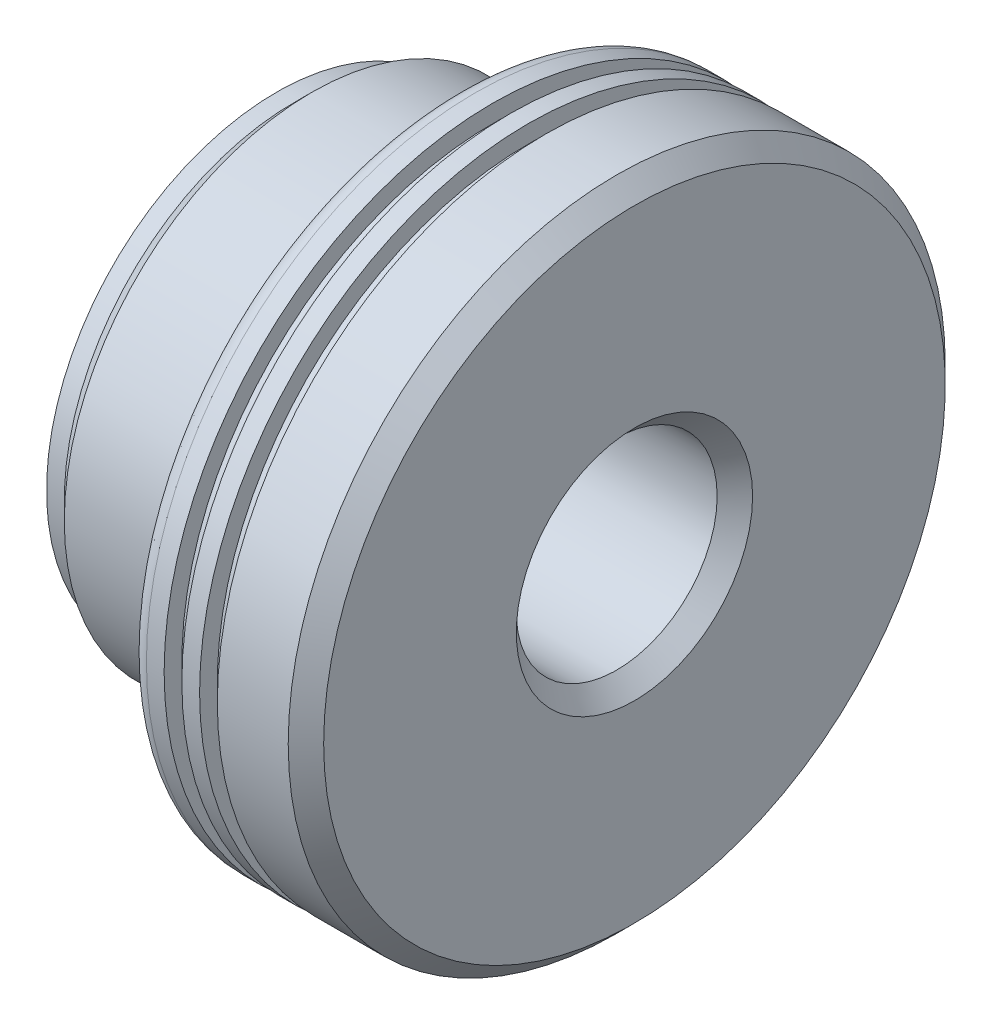
ISO-10303-21;
HEADER;
FILE_DESCRIPTION(('STEP AP214'),'2;1');
FILE_NAME('part.step','',(''),(''),'','','');
FILE_SCHEMA(('AUTOMOTIVE_DESIGN { 1 0 10303 214 1 1 1 1 }'));
ENDSEC;
DATA;
#1=APPLICATION_CONTEXT('core data for automotive mechanical design processes');
#2=APPLICATION_PROTOCOL_DEFINITION('international standard','automotive_design',2000,#1);
#3=PRODUCT_CONTEXT('',#1,'mechanical');
#4=PRODUCT('Part','Part','',(#3));
#5=PRODUCT_RELATED_PRODUCT_CATEGORY('part','',(#4));
#6=PRODUCT_DEFINITION_FORMATION('','',#4);
#7=PRODUCT_DEFINITION_CONTEXT('part definition',#1,'design');
#8=PRODUCT_DEFINITION('design','',#6,#7);
#9=PRODUCT_DEFINITION_SHAPE('','',#8);
#10=(LENGTH_UNIT() NAMED_UNIT(*) SI_UNIT(.MILLI.,.METRE.));
#11=(NAMED_UNIT(*) PLANE_ANGLE_UNIT() SI_UNIT($,.RADIAN.));
#12=(NAMED_UNIT(*) SI_UNIT($,.STERADIAN.) SOLID_ANGLE_UNIT());
#13=UNCERTAINTY_MEASURE_WITH_UNIT(LENGTH_MEASURE(1.E-05),#10,'distance_accuracy_value','');
#14=(GEOMETRIC_REPRESENTATION_CONTEXT(3) GLOBAL_UNCERTAINTY_ASSIGNED_CONTEXT((#13)) GLOBAL_UNIT_ASSIGNED_CONTEXT((#10,
#11,#12)) REPRESENTATION_CONTEXT('',''));
#15=CARTESIAN_POINT('',(0.,0.,0.));
#16=DIRECTION('',(0.,0.,1.));
#17=DIRECTION('',(1.,0.,0.));
#18=AXIS2_PLACEMENT_3D('',#15,#16,#17);
#19=CARTESIAN_POINT('',(-1.5,0.,2.2875));
#20=DIRECTION('',(-1.,0.,0.));
#21=DIRECTION('',(0.,0.,1.));
#22=AXIS2_PLACEMENT_3D('',#19,#20,#21);
#23=PLANE('',#22);
#24=CARTESIAN_POINT('',(-1.50000000000002,0.,0.));
#25=DIRECTION('',(1.,0.,0.));
#26=DIRECTION('',(0.,0.,1.));
#27=AXIS2_PLACEMENT_3D('',#24,#25,#26);
#28=CIRCLE('',#27,2.63);
#29=CARTESIAN_POINT('',(-1.50000000000001,0.,2.63));
#30=VERTEX_POINT('',#29);
#31=CARTESIAN_POINT('',(-1.50000000000001,0.,-2.63));
#32=VERTEX_POINT('',#31);
#33=EDGE_CURVE('E56',#30,#32,#28,.T.);
#34=ORIENTED_EDGE('',*,*,#33,.F.);
#35=CARTESIAN_POINT('',(-1.50000000000002,0.,0.));
#36=DIRECTION('',(1.,0.,0.));
#37=DIRECTION('',(0.,0.,-1.));
#38=AXIS2_PLACEMENT_3D('',#35,#36,#37);
#39=CIRCLE('',#38,2.63);
#40=EDGE_CURVE('E51',#32,#30,#39,.T.);
#41=ORIENTED_EDGE('',*,*,#40,.F.);
#42=EDGE_LOOP('',(#34,#41));
#43=FACE_BOUND('',#42,.T.);
#44=CARTESIAN_POINT('',(-1.49999999999996,0.,0.));
#45=DIRECTION('',(-1.,0.,0.));
#46=DIRECTION('',(0.,0.,-1.));
#47=AXIS2_PLACEMENT_3D('',#44,#45,#46);
#48=CIRCLE('',#47,1.945);
#49=CARTESIAN_POINT('',(-1.49999999999998,0.,1.945));
#50=VERTEX_POINT('',#49);
#51=CARTESIAN_POINT('',(-1.49999999999998,0.,-1.945));
#52=VERTEX_POINT('',#51);
#53=EDGE_CURVE('E65',#50,#52,#48,.F.);
#54=ORIENTED_EDGE('',*,*,#53,.T.);
#55=CARTESIAN_POINT('',(-1.49999999999996,0.,0.));
#56=DIRECTION('',(-1.,0.,0.));
#57=DIRECTION('',(0.,0.,1.));
#58=AXIS2_PLACEMENT_3D('',#55,#56,#57);
#59=CIRCLE('',#58,1.945);
#60=EDGE_CURVE('E104',#52,#50,#59,.F.);
#61=ORIENTED_EDGE('',*,*,#60,.T.);
#62=EDGE_LOOP('',(#54,#61));
#63=FACE_BOUND('',#62,.T.);
#64=ADVANCED_FACE('F16',(#43,#63),#23,.T.);
#65=CARTESIAN_POINT('',(-1.35000000000002,0.,0.));
#66=DIRECTION('',(1.,0.,0.));
#67=DIRECTION('',(0.,0.,-1.));
#68=AXIS2_PLACEMENT_3D('',#65,#66,#67);
#69=TOROIDAL_SURFACE('',#68,2.63,0.15);
#70=ORIENTED_EDGE('',*,*,#40,.T.);
#71=ORIENTED_EDGE('',*,*,#33,.T.);
#72=EDGE_LOOP('',(#70,#71));
#73=FACE_BOUND('',#72,.T.);
#74=CARTESIAN_POINT('',(-1.35,0.,0.));
#75=DIRECTION('',(1.,0.,0.));
#76=DIRECTION('',(0.,0.,-1.));
#77=AXIS2_PLACEMENT_3D('',#74,#75,#76);
#78=CIRCLE('',#77,2.78);
#79=CARTESIAN_POINT('',(-1.35,0.,-2.78));
#80=VERTEX_POINT('',#79);
#81=EDGE_CURVE('E91',#80,#80,#78,.T.);
#82=ORIENTED_EDGE('',*,*,#81,.F.);
#83=EDGE_LOOP('',(#82));
#84=FACE_BOUND('',#83,.T.);
#85=ADVANCED_FACE('F62',(#73,#84),#69,.T.);
#86=CARTESIAN_POINT('',(-1.64999999999996,0.,0.));
#87=DIRECTION('',(1.,0.,0.));
#88=DIRECTION('',(0.,0.,-1.));
#89=AXIS2_PLACEMENT_3D('',#86,#87,#88);
#90=TOROIDAL_SURFACE('',#89,1.945,0.15);
#91=ORIENTED_EDGE('',*,*,#60,.F.);
#92=ORIENTED_EDGE('',*,*,#53,.F.);
#93=EDGE_LOOP('',(#91,#92));
#94=FACE_BOUND('',#93,.T.);
#95=CARTESIAN_POINT('',(-1.65,0.,0.));
#96=DIRECTION('',(1.,0.,0.));
#97=DIRECTION('',(0.,0.,-1.));
#98=AXIS2_PLACEMENT_3D('',#95,#96,#97);
#99=CIRCLE('',#98,1.795);
#100=CARTESIAN_POINT('',(-1.65,0.,-1.795));
#101=VERTEX_POINT('',#100);
#102=EDGE_CURVE('E175',#101,#101,#99,.F.);
#103=ORIENTED_EDGE('',*,*,#102,.F.);
#104=EDGE_LOOP('',(#103));
#105=FACE_BOUND('',#104,.T.);
#106=ADVANCED_FACE('F83',(#94,#105),#90,.F.);
#107=CARTESIAN_POINT('',(-1.275,0.,0.));
#108=DIRECTION('',(1.,0.,0.));
#109=DIRECTION('',(0.,0.,-1.));
#110=AXIS2_PLACEMENT_3D('',#107,#108,#109);
#111=CYLINDRICAL_SURFACE('',#110,2.78);
#112=ORIENTED_EDGE('',*,*,#81,.T.);
#113=EDGE_LOOP('',(#112));
#114=FACE_BOUND('',#113,.T.);
#115=CARTESIAN_POINT('',(-1.2,0.,0.));
#116=DIRECTION('',(1.,0.,0.));
#117=DIRECTION('',(0.,0.,-1.));
#118=AXIS2_PLACEMENT_3D('',#115,#116,#117);
#119=CIRCLE('',#118,2.78);
#120=CARTESIAN_POINT('',(-1.2,0.,-2.78));
#121=VERTEX_POINT('',#120);
#122=EDGE_CURVE('E174',#121,#121,#119,.T.);
#123=ORIENTED_EDGE('',*,*,#122,.F.);
#124=EDGE_LOOP('',(#123));
#125=FACE_BOUND('',#124,.T.);
#126=ADVANCED_FACE('F188',(#114,#125),#111,.T.);
#127=CARTESIAN_POINT('',(-1.6875,0.,0.));
#128=DIRECTION('',(1.,0.,0.));
#129=DIRECTION('',(0.,0.,-1.));
#130=AXIS2_PLACEMENT_3D('',#127,#128,#129);
#131=CYLINDRICAL_SURFACE('',#130,1.795);
#132=ORIENTED_EDGE('',*,*,#102,.T.);
#133=EDGE_LOOP('',(#132));
#134=FACE_BOUND('',#133,.T.);
#135=CARTESIAN_POINT('',(-1.725,0.,0.));
#136=DIRECTION('',(1.,0.,0.));
#137=DIRECTION('',(0.,0.,-1.));
#138=AXIS2_PLACEMENT_3D('',#135,#136,#137);
#139=CIRCLE('',#138,1.795);
#140=CARTESIAN_POINT('',(-1.725,0.,-1.795));
#141=VERTEX_POINT('',#140);
#142=EDGE_CURVE('E164',#141,#141,#139,.T.);
#143=ORIENTED_EDGE('',*,*,#142,.T.);
#144=EDGE_LOOP('',(#143));
#145=FACE_BOUND('',#144,.T.);
#146=ADVANCED_FACE('F191',(#134,#145),#131,.T.);
#147=CARTESIAN_POINT('',(-1.2,0.,2.705));
#148=DIRECTION('',(1.,0.,0.));
#149=DIRECTION('',(0.,0.,-1.));
#150=AXIS2_PLACEMENT_3D('',#147,#148,#149);
#151=PLANE('',#150);
#152=CARTESIAN_POINT('',(-1.2,0.,0.));
#153=DIRECTION('',(1.,0.,0.));
#154=DIRECTION('',(0.,0.,-1.));
#155=AXIS2_PLACEMENT_3D('',#152,#153,#154);
#156=CIRCLE('',#155,2.63);
#157=CARTESIAN_POINT('',(-1.2,0.,-2.63));
#158=VERTEX_POINT('',#157);
#159=EDGE_CURVE('E173',#158,#158,#156,.T.);
#160=ORIENTED_EDGE('',*,*,#159,.F.);
#161=EDGE_LOOP('',(#160));
#162=FACE_BOUND('',#161,.T.);
#163=ORIENTED_EDGE('',*,*,#122,.T.);
#164=EDGE_LOOP('',(#163));
#165=FACE_BOUND('',#164,.T.);
#166=ADVANCED_FACE('F150',(#162,#165),#151,.T.);
#167=CARTESIAN_POINT('',(-1.72499999999996,0.,0.));
#168=DIRECTION('',(1.,0.,0.));
#169=DIRECTION('',(0.,0.,-1.));
#170=AXIS2_PLACEMENT_3D('',#167,#168,#169);
#171=TOROIDAL_SURFACE('',#170,1.945,0.15);
#172=ORIENTED_EDGE('',*,*,#142,.F.);
#173=EDGE_LOOP('',(#172));
#174=FACE_BOUND('',#173,.T.);
#175=CARTESIAN_POINT('',(-1.87499999999996,0.,0.));
#176=DIRECTION('',(1.,0.,0.));
#177=DIRECTION('',(0.,0.,-1.));
#178=AXIS2_PLACEMENT_3D('',#175,#176,#177);
#179=CIRCLE('',#178,1.945);
#180=CARTESIAN_POINT('',(-1.87499999999998,0.,1.945));
#181=VERTEX_POINT('',#180);
#182=CARTESIAN_POINT('',(-1.87499999999998,0.,-1.945));
#183=VERTEX_POINT('',#182);
#184=EDGE_CURVE('E36',#181,#183,#179,.F.);
#185=ORIENTED_EDGE('',*,*,#184,.F.);
#186=CARTESIAN_POINT('',(-1.87499999999996,0.,0.));
#187=DIRECTION('',(1.,0.,0.));
#188=DIRECTION('',(0.,0.,1.));
#189=AXIS2_PLACEMENT_3D('',#186,#187,#188);
#190=CIRCLE('',#189,1.945);
#191=EDGE_CURVE('E280',#183,#181,#190,.F.);
#192=ORIENTED_EDGE('',*,*,#191,.F.);
#193=EDGE_LOOP('',(#185,#192));
#194=FACE_BOUND('',#193,.T.);
#195=ADVANCED_FACE('F138',(#174,#194),#171,.F.);
#196=CARTESIAN_POINT('',(-1.125,0.,0.));
#197=DIRECTION('',(1.,0.,0.));
#198=DIRECTION('',(0.,0.,-1.));
#199=AXIS2_PLACEMENT_3D('',#196,#197,#198);
#200=CYLINDRICAL_SURFACE('',#199,2.63);
#201=ORIENTED_EDGE('',*,*,#159,.T.);
#202=EDGE_LOOP('',(#201));
#203=FACE_BOUND('',#202,.T.);
#204=CARTESIAN_POINT('',(-1.05,0.,0.));
#205=DIRECTION('',(1.,0.,0.));
#206=DIRECTION('',(0.,0.,-1.));
#207=AXIS2_PLACEMENT_3D('',#204,#205,#206);
#208=CIRCLE('',#207,2.63);
#209=CARTESIAN_POINT('',(-1.05,0.,-2.63));
#210=VERTEX_POINT('',#209);
#211=EDGE_CURVE('E282',#210,#210,#208,.T.);
#212=ORIENTED_EDGE('',*,*,#211,.F.);
#213=EDGE_LOOP('',(#212));
#214=FACE_BOUND('',#213,.T.);
#215=ADVANCED_FACE('F149',(#203,#214),#200,.T.);
#216=CARTESIAN_POINT('',(-1.875,0.,0.));
#217=DIRECTION('',(1.,0.,0.));
#218=DIRECTION('',(0.,0.,-1.));
#219=AXIS2_PLACEMENT_3D('',#216,#217,#218);
#220=PLANE('',#219);
#221=CARTESIAN_POINT('',(-1.875,0.,0.));
#222=DIRECTION('',(1.,0.,0.));
#223=DIRECTION('',(0.,0.,-1.));
#224=AXIS2_PLACEMENT_3D('',#221,#222,#223);
#225=CIRCLE('',#224,2.095);
#226=CARTESIAN_POINT('',(-1.875,0.,-2.095));
#227=VERTEX_POINT('',#226);
#228=EDGE_CURVE('E286',#227,#227,#225,.F.);
#229=ORIENTED_EDGE('',*,*,#228,.F.);
#230=EDGE_LOOP('',(#229));
#231=FACE_BOUND('',#230,.T.);
#232=ORIENTED_EDGE('',*,*,#191,.T.);
#233=ORIENTED_EDGE('',*,*,#184,.T.);
#234=EDGE_LOOP('',(#232,#233));
#235=FACE_BOUND('',#234,.T.);
#236=ADVANCED_FACE('F263',(#231,#235),#220,.T.);
#237=CARTESIAN_POINT('',(-1.05,0.,2.705));
#238=DIRECTION('',(-1.,0.,0.));
#239=DIRECTION('',(0.,0.,1.));
#240=AXIS2_PLACEMENT_3D('',#237,#238,#239);
#241=PLANE('',#240);
#242=CARTESIAN_POINT('',(-1.05,0.,0.));
#243=DIRECTION('',(1.,0.,0.));
#244=DIRECTION('',(0.,0.,-1.));
#245=AXIS2_PLACEMENT_3D('',#242,#243,#244);
#246=CIRCLE('',#245,2.78);
#247=CARTESIAN_POINT('',(-1.05,0.,-2.78));
#248=VERTEX_POINT('',#247);
#249=EDGE_CURVE('E296',#248,#248,#246,.T.);
#250=ORIENTED_EDGE('',*,*,#249,.F.);
#251=EDGE_LOOP('',(#250));
#252=FACE_BOUND('',#251,.T.);
#253=ORIENTED_EDGE('',*,*,#211,.T.);
#254=EDGE_LOOP('',(#253));
#255=FACE_BOUND('',#254,.T.);
#256=ADVANCED_FACE('F260',(#252,#255),#241,.T.);
#257=CARTESIAN_POINT('',(-2.3775,0.,0.));
#258=DIRECTION('',(1.,0.,0.));
#259=DIRECTION('',(0.,0.,-1.));
#260=AXIS2_PLACEMENT_3D('',#257,#258,#259);
#261=CYLINDRICAL_SURFACE('',#260,2.095);
#262=ORIENTED_EDGE('',*,*,#228,.T.);
#263=EDGE_LOOP('',(#262));
#264=FACE_BOUND('',#263,.T.);
#265=CARTESIAN_POINT('',(-2.72999999998547,0.,0.));
#266=DIRECTION('',(1.,0.,0.));
#267=DIRECTION('',(0.,0.,-1.));
#268=AXIS2_PLACEMENT_3D('',#265,#266,#267);
#269=CIRCLE('',#268,2.09499999999707);
#270=CARTESIAN_POINT('',(-2.72999999998547,0.,-2.09499999999707));
#271=VERTEX_POINT('',#270);
#272=EDGE_CURVE('E300',#271,#271,#269,.F.);
#273=ORIENTED_EDGE('',*,*,#272,.F.);
#274=EDGE_LOOP('',(#273));
#275=FACE_BOUND('',#274,.T.);
#276=ADVANCED_FACE('F256',(#264,#275),#261,.T.);
#277=CARTESIAN_POINT('',(-0.975,0.,0.));
#278=DIRECTION('',(1.,0.,0.));
#279=DIRECTION('',(0.,0.,-1.));
#280=AXIS2_PLACEMENT_3D('',#277,#278,#279);
#281=CYLINDRICAL_SURFACE('',#280,2.78);
#282=ORIENTED_EDGE('',*,*,#249,.T.);
#283=EDGE_LOOP('',(#282));
#284=FACE_BOUND('',#283,.T.);
#285=CARTESIAN_POINT('',(-0.900000000000001,0.,0.));
#286=DIRECTION('',(1.,0.,0.));
#287=DIRECTION('',(0.,0.,-1.));
#288=AXIS2_PLACEMENT_3D('',#285,#286,#287);
#289=CIRCLE('',#288,2.78);
#290=CARTESIAN_POINT('',(-0.9,0.,-2.78));
#291=VERTEX_POINT('',#290);
#292=EDGE_CURVE('E301',#291,#291,#289,.T.);
#293=ORIENTED_EDGE('',*,*,#292,.F.);
#294=EDGE_LOOP('',(#293));
#295=FACE_BOUND('',#294,.T.);
#296=ADVANCED_FACE('F252',(#284,#295),#281,.T.);
#297=CARTESIAN_POINT('',(-2.73000000004231,0.,0.));
#298=DIRECTION('',(1.,0.,0.));
#299=DIRECTION('',(0.,0.,-1.));
#300=AXIS2_PLACEMENT_3D('',#297,#298,#299);
#301=CONICAL_SURFACE('',#300,2.09499999994023,0.785398163397448);
#302=ORIENTED_EDGE('',*,*,#272,.T.);
#303=EDGE_LOOP('',(#302));
#304=FACE_BOUND('',#303,.T.);
#305=CARTESIAN_POINT('',(-2.88,0.,0.));
#306=DIRECTION('',(1.,0.,0.));
#307=DIRECTION('',(0.,0.,-1.));
#308=AXIS2_PLACEMENT_3D('',#305,#306,#307);
#309=CIRCLE('',#308,1.945);
#310=CARTESIAN_POINT('',(-2.88,0.,-1.945));
#311=VERTEX_POINT('',#310);
#312=EDGE_CURVE('E305',#311,#311,#309,.F.);
#313=ORIENTED_EDGE('',*,*,#312,.F.);
#314=EDGE_LOOP('',(#313));
#315=FACE_BOUND('',#314,.T.);
#316=ADVANCED_FACE('F248',(#304,#315),#301,.T.);
#317=CARTESIAN_POINT('',(-0.9,0.,2.705));
#318=DIRECTION('',(1.,0.,0.));
#319=DIRECTION('',(0.,0.,-1.));
#320=AXIS2_PLACEMENT_3D('',#317,#318,#319);
#321=PLANE('',#320);
#322=CARTESIAN_POINT('',(-0.900000000000001,0.,0.));
#323=DIRECTION('',(1.,0.,0.));
#324=DIRECTION('',(0.,0.,-1.));
#325=AXIS2_PLACEMENT_3D('',#322,#323,#324);
#326=CIRCLE('',#325,2.63);
#327=CARTESIAN_POINT('',(-0.9,0.,-2.63));
#328=VERTEX_POINT('',#327);
#329=EDGE_CURVE('E306',#328,#328,#326,.T.);
#330=ORIENTED_EDGE('',*,*,#329,.F.);
#331=EDGE_LOOP('',(#330));
#332=FACE_BOUND('',#331,.T.);
#333=ORIENTED_EDGE('',*,*,#292,.T.);
#334=EDGE_LOOP('',(#333));
#335=FACE_BOUND('',#334,.T.);
#336=ADVANCED_FACE('F244',(#332,#335),#321,.T.);
#337=CARTESIAN_POINT('',(-2.4525,0.,0.));
#338=DIRECTION('',(1.,0.,0.));
#339=DIRECTION('',(0.,0.,-1.));
#340=AXIS2_PLACEMENT_3D('',#337,#338,#339);
#341=CYLINDRICAL_SURFACE('',#340,1.945);
#342=ORIENTED_EDGE('',*,*,#312,.T.);
#343=EDGE_LOOP('',(#342));
#344=FACE_BOUND('',#343,.T.);
#345=CARTESIAN_POINT('',(-3.03,0.,0.));
#346=DIRECTION('',(1.,0.,0.));
#347=DIRECTION('',(0.,0.,-1.));
#348=AXIS2_PLACEMENT_3D('',#345,#346,#347);
#349=CIRCLE('',#348,1.945);
#350=CARTESIAN_POINT('',(-3.03,0.,-1.945));
#351=VERTEX_POINT('',#350);
#352=EDGE_CURVE('E310',#351,#351,#349,.F.);
#353=ORIENTED_EDGE('',*,*,#352,.F.);
#354=EDGE_LOOP('',(#353));
#355=FACE_BOUND('',#354,.T.);
#356=ADVANCED_FACE('F240',(#344,#355),#341,.T.);
#357=CARTESIAN_POINT('',(-0.825,0.,0.));
#358=DIRECTION('',(1.,0.,0.));
#359=DIRECTION('',(0.,0.,-1.));
#360=AXIS2_PLACEMENT_3D('',#357,#358,#359);
#361=CYLINDRICAL_SURFACE('',#360,2.63);
#362=ORIENTED_EDGE('',*,*,#329,.T.);
#363=EDGE_LOOP('',(#362));
#364=FACE_BOUND('',#363,.T.);
#365=CARTESIAN_POINT('',(-0.75,0.,0.));
#366=DIRECTION('',(1.,0.,0.));
#367=DIRECTION('',(0.,0.,-1.));
#368=AXIS2_PLACEMENT_3D('',#365,#366,#367);
#369=CIRCLE('',#368,2.63);
#370=CARTESIAN_POINT('',(-0.749999999999999,0.,-2.63));
#371=VERTEX_POINT('',#370);
#372=EDGE_CURVE('E314',#371,#371,#369,.T.);
#373=ORIENTED_EDGE('',*,*,#372,.F.);
#374=EDGE_LOOP('',(#373));
#375=FACE_BOUND('',#374,.T.);
#376=ADVANCED_FACE('F236',(#364,#375),#361,.T.);
#377=CARTESIAN_POINT('',(-3.03,0.,0.972499999999999));
#378=DIRECTION('',(-1.,0.,0.));
#379=DIRECTION('',(0.,0.,1.));
#380=AXIS2_PLACEMENT_3D('',#377,#378,#379);
#381=PLANE('',#380);
#382=CARTESIAN_POINT('',(-3.02999999991016,0.,0.));
#383=DIRECTION('',(-1.,0.,0.));
#384=DIRECTION('',(0.,0.,1.));
#385=AXIS2_PLACEMENT_3D('',#382,#383,#384);
#386=CIRCLE('',#385,1.0000000000332);
#387=CARTESIAN_POINT('',(-3.02999999991016,0.,1.0000000000332));
#388=VERTEX_POINT('',#387);
#389=EDGE_CURVE('E318',#388,#388,#386,.F.);
#390=ORIENTED_EDGE('',*,*,#389,.T.);
#391=EDGE_LOOP('',(#390));
#392=FACE_BOUND('',#391,.T.);
#393=ORIENTED_EDGE('',*,*,#352,.T.);
#394=EDGE_LOOP('',(#393));
#395=FACE_BOUND('',#394,.T.);
#396=ADVANCED_FACE('F232',(#392,#395),#381,.T.);
#397=CARTESIAN_POINT('',(-0.75,0.,2.705));
#398=DIRECTION('',(-1.,0.,0.));
#399=DIRECTION('',(0.,0.,1.));
#400=AXIS2_PLACEMENT_3D('',#397,#398,#399);
#401=PLANE('',#400);
#402=CARTESIAN_POINT('',(-0.75,0.,0.));
#403=DIRECTION('',(1.,0.,0.));
#404=DIRECTION('',(0.,0.,-1.));
#405=AXIS2_PLACEMENT_3D('',#402,#403,#404);
#406=CIRCLE('',#405,2.78);
#407=CARTESIAN_POINT('',(-0.749999999999999,0.,-2.78));
#408=VERTEX_POINT('',#407);
#409=EDGE_CURVE('E322',#408,#408,#406,.T.);
#410=ORIENTED_EDGE('',*,*,#409,.F.);
#411=EDGE_LOOP('',(#410));
#412=FACE_BOUND('',#411,.T.);
#413=ORIENTED_EDGE('',*,*,#372,.T.);
#414=EDGE_LOOP('',(#413));
#415=FACE_BOUND('',#414,.T.);
#416=ADVANCED_FACE('F228',(#412,#415),#401,.T.);
#417=CARTESIAN_POINT('',(-3.02999999985332,0.,0.));
#418=DIRECTION('',(-1.,0.,0.));
#419=DIRECTION('',(0.,0.,1.));
#420=AXIS2_PLACEMENT_3D('',#417,#418,#419);
#421=CONICAL_SURFACE('',#420,0.999999999976354,0.785398163586928);
#422=CARTESIAN_POINT('',(-2.88,0.,0.));
#423=DIRECTION('',(1.,0.,0.));
#424=DIRECTION('',(0.,0.,-1.));
#425=AXIS2_PLACEMENT_3D('',#422,#423,#424);
#426=CIRCLE('',#425,0.85);
#427=CARTESIAN_POINT('',(-2.88,0.,-0.850000000000001));
#428=VERTEX_POINT('',#427);
#429=EDGE_CURVE('E325',#428,#428,#426,.T.);
#430=ORIENTED_EDGE('',*,*,#429,.T.);
#431=EDGE_LOOP('',(#430));
#432=FACE_BOUND('',#431,.T.);
#433=ORIENTED_EDGE('',*,*,#389,.F.);
#434=EDGE_LOOP('',(#433));
#435=FACE_BOUND('',#434,.T.);
#436=ADVANCED_FACE('F224',(#432,#435),#421,.F.);
#437=CARTESIAN_POINT('',(-0.45,0.,0.));
#438=DIRECTION('',(1.,0.,0.));
#439=DIRECTION('',(0.,0.,-1.));
#440=AXIS2_PLACEMENT_3D('',#437,#438,#439);
#441=CYLINDRICAL_SURFACE('',#440,2.78);
#442=CARTESIAN_POINT('',(-0.149999999962346,0.,0.));
#443=DIRECTION('',(-1.,0.,0.));
#444=DIRECTION('',(0.,0.,1.));
#445=AXIS2_PLACEMENT_3D('',#442,#443,#444);
#446=CIRCLE('',#445,2.77999999991607);
#447=CARTESIAN_POINT('',(-0.149999999962347,0.,2.77999999991607));
#448=VERTEX_POINT('',#447);
#449=EDGE_CURVE('E332',#448,#448,#446,.F.);
#450=ORIENTED_EDGE('',*,*,#449,.F.);
#451=EDGE_LOOP('',(#450));
#452=FACE_BOUND('',#451,.T.);
#453=ORIENTED_EDGE('',*,*,#409,.T.);
#454=EDGE_LOOP('',(#453));
#455=FACE_BOUND('',#454,.T.);
#456=ADVANCED_FACE('F220',(#452,#455),#441,.T.);
#457=CARTESIAN_POINT('',(-1.515,0.,0.));
#458=DIRECTION('',(1.,0.,0.));
#459=DIRECTION('',(0.,0.,-1.));
#460=AXIS2_PLACEMENT_3D('',#457,#458,#459);
#461=CYLINDRICAL_SURFACE('',#460,0.85);
#462=ORIENTED_EDGE('',*,*,#429,.F.);
#463=EDGE_LOOP('',(#462));
#464=FACE_BOUND('',#463,.T.);
#465=CARTESIAN_POINT('',(-0.149999999962347,0.,0.));
#466=DIRECTION('',(1.,0.,0.));
#467=DIRECTION('',(0.,0.,-1.));
#468=AXIS2_PLACEMENT_3D('',#465,#466,#467);
#469=CIRCLE('',#468,0.849999999900319);
#470=CARTESIAN_POINT('',(-0.149999999962347,0.,-0.849999999900319));
#471=VERTEX_POINT('',#470);
#472=EDGE_CURVE('E328',#471,#471,#469,.T.);
#473=ORIENTED_EDGE('',*,*,#472,.T.);
#474=EDGE_LOOP('',(#473));
#475=FACE_BOUND('',#474,.T.);
#476=ADVANCED_FACE('F216',(#464,#475),#461,.F.);
#477=CARTESIAN_POINT('',(-0.149999999962346,0.,0.));
#478=DIRECTION('',(-1.,0.,0.));
#479=DIRECTION('',(0.,0.,1.));
#480=AXIS2_PLACEMENT_3D('',#477,#478,#479);
#481=CONICAL_SURFACE('',#480,2.77999999991607,0.785398163397448);
#482=ORIENTED_EDGE('',*,*,#449,.T.);
#483=EDGE_LOOP('',(#482));
#484=FACE_BOUND('',#483,.T.);
#485=CARTESIAN_POINT('',(-1.13686349830638E-10,0.,0.));
#486=DIRECTION('',(-1.,0.,0.));
#487=DIRECTION('',(0.,0.,1.));
#488=AXIS2_PLACEMENT_3D('',#485,#486,#487);
#489=CIRCLE('',#488,2.63000000006741);
#490=CARTESIAN_POINT('',(-1.13686837039115E-10,0.,2.63000000006741));
#491=VERTEX_POINT('',#490);
#492=EDGE_CURVE('E28',#491,#491,#489,.F.);
#493=ORIENTED_EDGE('',*,*,#492,.F.);
#494=EDGE_LOOP('',(#493));
#495=FACE_BOUND('',#494,.T.);
#496=ADVANCED_FACE('F209',(#484,#495),#481,.T.);
#497=CARTESIAN_POINT('',(0.,0.,0.));
#498=DIRECTION('',(1.,0.,0.));
#499=DIRECTION('',(0.,0.,-1.));
#500=AXIS2_PLACEMENT_3D('',#497,#498,#499);
#501=CONICAL_SURFACE('',#500,0.999999999862666,0.785398163397448);
#502=ORIENTED_EDGE('',*,*,#472,.F.);
#503=EDGE_LOOP('',(#502));
#504=FACE_BOUND('',#503,.T.);
#505=CARTESIAN_POINT('',(0.,0.,0.));
#506=DIRECTION('',(1.,0.,0.));
#507=DIRECTION('',(0.,0.,-1.));
#508=AXIS2_PLACEMENT_3D('',#505,#506,#507);
#509=CIRCLE('',#508,0.999999999862666);
#510=CARTESIAN_POINT('',(0.,0.,-0.999999999862666));
#511=VERTEX_POINT('',#510);
#512=EDGE_CURVE('E11',#511,#511,#509,.F.);
#513=ORIENTED_EDGE('',*,*,#512,.F.);
#514=EDGE_LOOP('',(#513));
#515=FACE_BOUND('',#514,.T.);
#516=ADVANCED_FACE('F203',(#504,#515),#501,.F.);
#517=CARTESIAN_POINT('',(0.,0.,1.315));
#518=DIRECTION('',(1.,0.,0.));
#519=DIRECTION('',(0.,0.,-1.));
#520=AXIS2_PLACEMENT_3D('',#517,#518,#519);
#521=PLANE('',#520);
#522=ORIENTED_EDGE('',*,*,#512,.T.);
#523=EDGE_LOOP('',(#522));
#524=FACE_BOUND('',#523,.T.);
#525=ORIENTED_EDGE('',*,*,#492,.T.);
#526=EDGE_LOOP('',(#525));
#527=FACE_BOUND('',#526,.T.);
#528=ADVANCED_FACE('F201',(#524,#527),#521,.T.);
#529=CLOSED_SHELL('',(#64,#85,#106,#126,#146,#166,#195,#215,#236,#256,#276,#296,#316,#336,#356,
#376,#396,#416,#436,#456,#476,#496,#516,#528));
#530=MANIFOLD_SOLID_BREP('B1',#529);
#531=ADVANCED_BREP_SHAPE_REPRESENTATION('',(#18,#530),#14);
#532=SHAPE_DEFINITION_REPRESENTATION(#9,#531);
ENDSEC;
END-ISO-10303-21;
